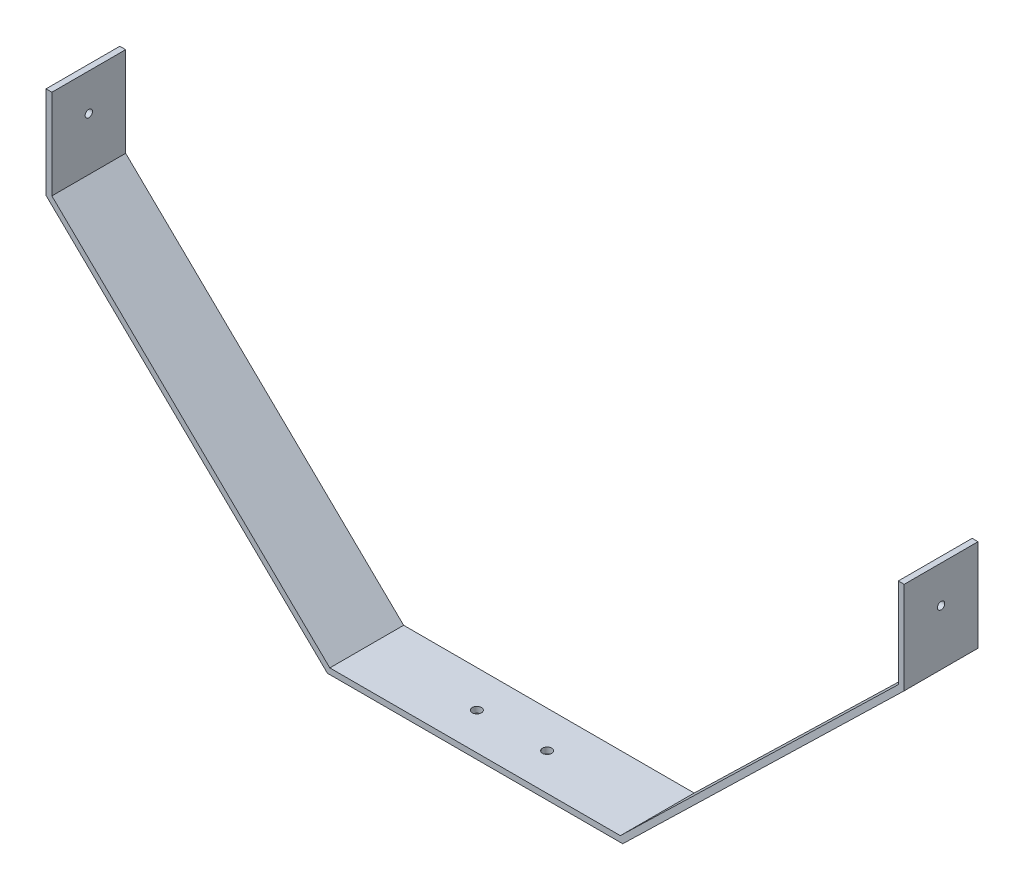
ISO-10303-21;
HEADER;
FILE_DESCRIPTION(('STEP AP214'),'2;1');
FILE_NAME('part.step','',(''),(''),'','','');
FILE_SCHEMA(('AUTOMOTIVE_DESIGN { 1 0 10303 214 1 1 1 1 }'));
ENDSEC;
DATA;
#1=APPLICATION_CONTEXT('core data for automotive mechanical design processes');
#2=APPLICATION_PROTOCOL_DEFINITION('international standard','automotive_design',2000,#1);
#3=PRODUCT_CONTEXT('',#1,'mechanical');
#4=PRODUCT('Part','Part','',(#3));
#5=PRODUCT_RELATED_PRODUCT_CATEGORY('part','',(#4));
#6=PRODUCT_DEFINITION_FORMATION('','',#4);
#7=PRODUCT_DEFINITION_CONTEXT('part definition',#1,'design');
#8=PRODUCT_DEFINITION('design','',#6,#7);
#9=PRODUCT_DEFINITION_SHAPE('','',#8);
#10=(LENGTH_UNIT() NAMED_UNIT(*) SI_UNIT(.MILLI.,.METRE.));
#11=(NAMED_UNIT(*) PLANE_ANGLE_UNIT() SI_UNIT($,.RADIAN.));
#12=(NAMED_UNIT(*) SI_UNIT($,.STERADIAN.) SOLID_ANGLE_UNIT());
#13=UNCERTAINTY_MEASURE_WITH_UNIT(LENGTH_MEASURE(1.E-05),#10,'distance_accuracy_value','');
#14=(GEOMETRIC_REPRESENTATION_CONTEXT(3) GLOBAL_UNCERTAINTY_ASSIGNED_CONTEXT((#13)) GLOBAL_UNIT_ASSIGNED_CONTEXT((#10,
#11,#12)) REPRESENTATION_CONTEXT('',''));
#15=CARTESIAN_POINT('',(0.,0.,0.));
#16=DIRECTION('',(0.,0.,1.));
#17=DIRECTION('',(1.,0.,0.));
#18=AXIS2_PLACEMENT_3D('',#15,#16,#17);
#19=CARTESIAN_POINT('',(-80.,0.,40.));
#20=DIRECTION('',(0.696439743144263,0.717615275875001,0.));
#21=DIRECTION('',(-0.717615275875001,0.696439743144263,0.));
#22=AXIS2_PLACEMENT_3D('',#19,#20,#21);
#23=PLANE('',#22);
#24=DIRECTION('',(0.717615275875001,-0.696439743144263,0.));
#25=VECTOR('',#24,1.);
#26=CARTESIAN_POINT('',(-80.,0.,0.));
#27=LINE('',#26,#25);
#28=CARTESIAN_POINT('',(-232.5,148.,0.));
#29=VERTEX_POINT('',#28);
#30=CARTESIAN_POINT('',(-80.,0.,0.));
#31=VERTEX_POINT('',#30);
#32=EDGE_CURVE('E155',#29,#31,#27,.T.);
#33=ORIENTED_EDGE('',*,*,#32,.T.);
#34=DIRECTION('',(0.,0.,-1.));
#35=VECTOR('',#34,1.);
#36=CARTESIAN_POINT('',(-80.,0.,40.));
#37=LINE('',#36,#35);
#38=CARTESIAN_POINT('',(-80.,0.,40.));
#39=VERTEX_POINT('',#38);
#40=EDGE_CURVE('E11',#39,#31,#37,.T.);
#41=ORIENTED_EDGE('',*,*,#40,.F.);
#42=DIRECTION('',(0.717615275875001,-0.696439743144263,0.));
#43=VECTOR('',#42,1.);
#44=CARTESIAN_POINT('',(-80.,0.,40.));
#45=LINE('',#44,#43);
#46=CARTESIAN_POINT('',(-232.5,148.,40.));
#47=VERTEX_POINT('',#46);
#48=EDGE_CURVE('E177',#47,#39,#45,.T.);
#49=ORIENTED_EDGE('',*,*,#48,.F.);
#50=DIRECTION('',(0.,0.,-1.));
#51=VECTOR('',#50,1.);
#52=CARTESIAN_POINT('',(-232.5,148.,40.));
#53=LINE('',#52,#51);
#54=EDGE_CURVE('E151',#47,#29,#53,.T.);
#55=ORIENTED_EDGE('',*,*,#54,.T.);
#56=EDGE_LOOP('',(#33,#41,#49,#55));
#57=FACE_BOUND('',#56,.T.);
#58=ADVANCED_FACE('F33',(#57),#23,.F.);
#59=CARTESIAN_POINT('',(-80.,0.,40.));
#60=DIRECTION('',(0.,1.,0.));
#61=DIRECTION('',(0.,0.,1.));
#62=AXIS2_PLACEMENT_3D('',#59,#60,#61);
#63=PLANE('',#62);
#64=CARTESIAN_POINT('',(-19.05,0.,20.));
#65=DIRECTION('',(0.,1.,0.));
#66=DIRECTION('',(0.,0.,1.));
#67=AXIS2_PLACEMENT_3D('',#64,#65,#66);
#68=CIRCLE('',#67,2.5);
#69=CARTESIAN_POINT('',(-19.05,0.,22.5));
#70=VERTEX_POINT('',#69);
#71=EDGE_CURVE('E202',#70,#70,#68,.T.);
#72=ORIENTED_EDGE('',*,*,#71,.T.);
#73=EDGE_LOOP('',(#72));
#74=FACE_BOUND('',#73,.T.);
#75=CARTESIAN_POINT('',(19.05,0.,20.));
#76=DIRECTION('',(0.,1.,0.));
#77=DIRECTION('',(0.,0.,1.));
#78=AXIS2_PLACEMENT_3D('',#75,#76,#77);
#79=CIRCLE('',#78,2.5);
#80=CARTESIAN_POINT('',(19.05,0.,22.5));
#81=VERTEX_POINT('',#80);
#82=EDGE_CURVE('E207',#81,#81,#79,.T.);
#83=ORIENTED_EDGE('',*,*,#82,.T.);
#84=EDGE_LOOP('',(#83));
#85=FACE_BOUND('',#84,.T.);
#86=DIRECTION('',(1.,0.,0.));
#87=VECTOR('',#86,1.);
#88=CARTESIAN_POINT('',(-80.,0.,0.));
#89=LINE('',#88,#87);
#90=CARTESIAN_POINT('',(80.,0.,0.));
#91=VERTEX_POINT('',#90);
#92=EDGE_CURVE('E158',#31,#91,#89,.T.);
#93=ORIENTED_EDGE('',*,*,#92,.T.);
#94=DIRECTION('',(0.,0.,-1.));
#95=VECTOR('',#94,1.);
#96=CARTESIAN_POINT('',(80.,0.,40.));
#97=LINE('',#96,#95);
#98=CARTESIAN_POINT('',(80.,0.,40.));
#99=VERTEX_POINT('',#98);
#100=EDGE_CURVE('E42',#99,#91,#97,.T.);
#101=ORIENTED_EDGE('',*,*,#100,.F.);
#102=DIRECTION('',(1.,0.,0.));
#103=VECTOR('',#102,1.);
#104=CARTESIAN_POINT('',(-80.,0.,40.));
#105=LINE('',#104,#103);
#106=EDGE_CURVE('E106',#39,#99,#105,.T.);
#107=ORIENTED_EDGE('',*,*,#106,.F.);
#108=ORIENTED_EDGE('',*,*,#40,.T.);
#109=EDGE_LOOP('',(#93,#101,#107,#108));
#110=FACE_BOUND('',#109,.T.);
#111=ADVANCED_FACE('F260',(#74,#85,#110),#63,.F.);
#112=CARTESIAN_POINT('',(80.,0.,40.));
#113=DIRECTION('',(-0.696439743144263,0.717615275875001,0.));
#114=DIRECTION('',(-0.717615275875001,-0.696439743144263,0.));
#115=AXIS2_PLACEMENT_3D('',#112,#113,#114);
#116=PLANE('',#115);
#117=DIRECTION('',(0.717615275875001,0.696439743144263,0.));
#118=VECTOR('',#117,1.);
#119=CARTESIAN_POINT('',(80.,0.,0.));
#120=LINE('',#119,#118);
#121=CARTESIAN_POINT('',(232.5,148.,0.));
#122=VERTEX_POINT('',#121);
#123=EDGE_CURVE('E160',#91,#122,#120,.T.);
#124=ORIENTED_EDGE('',*,*,#123,.T.);
#125=DIRECTION('',(0.,0.,-1.));
#126=VECTOR('',#125,1.);
#127=CARTESIAN_POINT('',(232.5,148.,40.));
#128=LINE('',#127,#126);
#129=CARTESIAN_POINT('',(232.5,148.,40.));
#130=VERTEX_POINT('',#129);
#131=EDGE_CURVE('E196',#130,#122,#128,.T.);
#132=ORIENTED_EDGE('',*,*,#131,.F.);
#133=DIRECTION('',(0.717615275875001,0.696439743144263,0.));
#134=VECTOR('',#133,1.);
#135=CARTESIAN_POINT('',(80.,0.,40.));
#136=LINE('',#135,#134);
#137=EDGE_CURVE('E219',#99,#130,#136,.T.);
#138=ORIENTED_EDGE('',*,*,#137,.F.);
#139=ORIENTED_EDGE('',*,*,#100,.T.);
#140=EDGE_LOOP('',(#124,#132,#138,#139));
#141=FACE_BOUND('',#140,.T.);
#142=ADVANCED_FACE('F264',(#141),#116,.F.);
#143=CARTESIAN_POINT('',(232.5,148.,40.));
#144=DIRECTION('',(-1.,0.,0.));
#145=DIRECTION('',(0.,0.,1.));
#146=AXIS2_PLACEMENT_3D('',#143,#144,#145);
#147=PLANE('',#146);
#148=CARTESIAN_POINT('',(232.5,178.,20.));
#149=DIRECTION('',(-1.,0.,0.));
#150=DIRECTION('',(0.,0.,1.));
#151=AXIS2_PLACEMENT_3D('',#148,#149,#150);
#152=CIRCLE('',#151,1.98437500000001);
#153=CARTESIAN_POINT('',(232.5,178.,21.984375));
#154=VERTEX_POINT('',#153);
#155=EDGE_CURVE('E301',#154,#154,#152,.T.);
#156=ORIENTED_EDGE('',*,*,#155,.T.);
#157=EDGE_LOOP('',(#156));
#158=FACE_BOUND('',#157,.T.);
#159=DIRECTION('',(0.,1.,0.));
#160=VECTOR('',#159,1.);
#161=CARTESIAN_POINT('',(232.5,148.,0.));
#162=LINE('',#161,#160);
#163=CARTESIAN_POINT('',(232.5,198.,0.));
#164=VERTEX_POINT('',#163);
#165=EDGE_CURVE('E162',#122,#164,#162,.T.);
#166=ORIENTED_EDGE('',*,*,#165,.T.);
#167=DIRECTION('',(0.,0.,-1.));
#168=VECTOR('',#167,1.);
#169=CARTESIAN_POINT('',(232.5,198.,40.));
#170=LINE('',#169,#168);
#171=CARTESIAN_POINT('',(232.5,198.,40.));
#172=VERTEX_POINT('',#171);
#173=EDGE_CURVE('E193',#172,#164,#170,.T.);
#174=ORIENTED_EDGE('',*,*,#173,.F.);
#175=DIRECTION('',(0.,1.,0.));
#176=VECTOR('',#175,1.);
#177=CARTESIAN_POINT('',(232.5,148.,40.));
#178=LINE('',#177,#176);
#179=EDGE_CURVE('E221',#130,#172,#178,.T.);
#180=ORIENTED_EDGE('',*,*,#179,.F.);
#181=ORIENTED_EDGE('',*,*,#131,.T.);
#182=EDGE_LOOP('',(#166,#174,#180,#181));
#183=FACE_BOUND('',#182,.T.);
#184=ADVANCED_FACE('F268',(#158,#183),#147,.F.);
#185=CARTESIAN_POINT('',(229.325,198.,40.));
#186=DIRECTION('',(0.,-1.,0.));
#187=DIRECTION('',(0.,0.,-1.));
#188=AXIS2_PLACEMENT_3D('',#185,#186,#187);
#189=PLANE('',#188);
#190=DIRECTION('',(-1.,0.,0.));
#191=VECTOR('',#190,1.);
#192=CARTESIAN_POINT('',(229.325,198.,0.));
#193=LINE('',#192,#191);
#194=CARTESIAN_POINT('',(229.325,198.,0.));
#195=VERTEX_POINT('',#194);
#196=EDGE_CURVE('E164',#164,#195,#193,.T.);
#197=ORIENTED_EDGE('',*,*,#196,.T.);
#198=DIRECTION('',(0.,0.,-1.));
#199=VECTOR('',#198,1.);
#200=CARTESIAN_POINT('',(229.325,198.,40.));
#201=LINE('',#200,#199);
#202=CARTESIAN_POINT('',(229.325,198.,40.));
#203=VERTEX_POINT('',#202);
#204=EDGE_CURVE('E190',#203,#195,#201,.T.);
#205=ORIENTED_EDGE('',*,*,#204,.F.);
#206=DIRECTION('',(-1.,0.,0.));
#207=VECTOR('',#206,1.);
#208=CARTESIAN_POINT('',(229.325,198.,40.));
#209=LINE('',#208,#207);
#210=EDGE_CURVE('E223',#172,#203,#209,.T.);
#211=ORIENTED_EDGE('',*,*,#210,.F.);
#212=ORIENTED_EDGE('',*,*,#173,.T.);
#213=EDGE_LOOP('',(#197,#205,#211,#212));
#214=FACE_BOUND('',#213,.T.);
#215=ADVANCED_FACE('F275',(#214),#189,.F.);
#216=CARTESIAN_POINT('',(229.325,149.343064797975,40.));
#217=DIRECTION('',(1.,0.,0.));
#218=DIRECTION('',(0.,1.,0.));
#219=AXIS2_PLACEMENT_3D('',#216,#217,#218);
#220=PLANE('',#219);
#221=CARTESIAN_POINT('',(229.325,178.,20.));
#222=DIRECTION('',(1.,0.,0.));
#223=DIRECTION('',(0.,1.,0.));
#224=AXIS2_PLACEMENT_3D('',#221,#222,#223);
#225=CIRCLE('',#224,1.98437500000001);
#226=CARTESIAN_POINT('',(229.325,179.984375,20.));
#227=VERTEX_POINT('',#226);
#228=EDGE_CURVE('E212',#227,#227,#225,.T.);
#229=ORIENTED_EDGE('',*,*,#228,.T.);
#230=EDGE_LOOP('',(#229));
#231=FACE_BOUND('',#230,.T.);
#232=DIRECTION('',(0.,-1.,0.));
#233=VECTOR('',#232,1.);
#234=CARTESIAN_POINT('',(229.325,149.343064797975,0.));
#235=LINE('',#234,#233);
#236=CARTESIAN_POINT('',(229.325,149.343064797975,0.));
#237=VERTEX_POINT('',#236);
#238=EDGE_CURVE('E166',#195,#237,#235,.T.);
#239=ORIENTED_EDGE('',*,*,#238,.T.);
#240=DIRECTION('',(0.,0.,-1.));
#241=VECTOR('',#240,1.);
#242=CARTESIAN_POINT('',(229.325,149.343064797975,40.));
#243=LINE('',#242,#241);
#244=CARTESIAN_POINT('',(229.325,149.343064797975,40.));
#245=VERTEX_POINT('',#244);
#246=EDGE_CURVE('E187',#245,#237,#243,.T.);
#247=ORIENTED_EDGE('',*,*,#246,.F.);
#248=DIRECTION('',(0.,-1.,0.));
#249=VECTOR('',#248,1.);
#250=CARTESIAN_POINT('',(229.325,149.343064797975,40.));
#251=LINE('',#250,#249);
#252=EDGE_CURVE('E225',#203,#245,#251,.T.);
#253=ORIENTED_EDGE('',*,*,#252,.F.);
#254=ORIENTED_EDGE('',*,*,#204,.T.);
#255=EDGE_LOOP('',(#239,#247,#253,#254));
#256=FACE_BOUND('',#255,.T.);
#257=ADVANCED_FACE('F279',(#231,#256),#220,.F.);
#258=CARTESIAN_POINT('',(78.7126359345188,3.175,40.));
#259=DIRECTION('',(0.696439743144263,-0.717615275875001,0.));
#260=DIRECTION('',(0.717615275875001,0.696439743144263,0.));
#261=AXIS2_PLACEMENT_3D('',#258,#259,#260);
#262=PLANE('',#261);
#263=DIRECTION('',(-0.717615275875001,-0.696439743144263,0.));
#264=VECTOR('',#263,1.);
#265=CARTESIAN_POINT('',(78.7126359345188,3.175,0.));
#266=LINE('',#265,#264);
#267=CARTESIAN_POINT('',(78.7126359345188,3.175,0.));
#268=VERTEX_POINT('',#267);
#269=EDGE_CURVE('E168',#237,#268,#266,.T.);
#270=ORIENTED_EDGE('',*,*,#269,.T.);
#271=DIRECTION('',(0.,0.,-1.));
#272=VECTOR('',#271,1.);
#273=CARTESIAN_POINT('',(78.7126359345188,3.175,40.));
#274=LINE('',#273,#272);
#275=CARTESIAN_POINT('',(78.7126359345188,3.175,40.));
#276=VERTEX_POINT('',#275);
#277=EDGE_CURVE('E184',#276,#268,#274,.T.);
#278=ORIENTED_EDGE('',*,*,#277,.F.);
#279=DIRECTION('',(-0.717615275875001,-0.696439743144263,0.));
#280=VECTOR('',#279,1.);
#281=CARTESIAN_POINT('',(78.7126359345188,3.175,40.));
#282=LINE('',#281,#280);
#283=EDGE_CURVE('E227',#245,#276,#282,.T.);
#284=ORIENTED_EDGE('',*,*,#283,.F.);
#285=ORIENTED_EDGE('',*,*,#246,.T.);
#286=EDGE_LOOP('',(#270,#278,#284,#285));
#287=FACE_BOUND('',#286,.T.);
#288=ADVANCED_FACE('F283',(#287),#262,.F.);
#289=CARTESIAN_POINT('',(-78.7126359345188,3.175,40.));
#290=DIRECTION('',(0.,-1.,0.));
#291=DIRECTION('',(1.,0.,0.));
#292=AXIS2_PLACEMENT_3D('',#289,#290,#291);
#293=PLANE('',#292);
#294=CARTESIAN_POINT('',(-19.05,3.175,20.));
#295=DIRECTION('',(0.,-1.,0.));
#296=DIRECTION('',(1.,0.,0.));
#297=AXIS2_PLACEMENT_3D('',#294,#295,#296);
#298=CIRCLE('',#297,2.5);
#299=CARTESIAN_POINT('',(-19.05,3.175,22.5));
#300=VERTEX_POINT('',#299);
#301=EDGE_CURVE('E36',#300,#300,#298,.T.);
#302=ORIENTED_EDGE('',*,*,#301,.T.);
#303=EDGE_LOOP('',(#302));
#304=FACE_BOUND('',#303,.T.);
#305=CARTESIAN_POINT('',(19.05,3.175,20.));
#306=DIRECTION('',(0.,-1.,0.));
#307=DIRECTION('',(1.,0.,0.));
#308=AXIS2_PLACEMENT_3D('',#305,#306,#307);
#309=CIRCLE('',#308,2.5);
#310=CARTESIAN_POINT('',(19.05,3.175,22.5));
#311=VERTEX_POINT('',#310);
#312=EDGE_CURVE('E200',#311,#311,#309,.T.);
#313=ORIENTED_EDGE('',*,*,#312,.T.);
#314=EDGE_LOOP('',(#313));
#315=FACE_BOUND('',#314,.T.);
#316=DIRECTION('',(-1.,0.,0.));
#317=VECTOR('',#316,1.);
#318=CARTESIAN_POINT('',(-78.7126359345188,3.175,0.));
#319=LINE('',#318,#317);
#320=CARTESIAN_POINT('',(-78.7126359345188,3.175,0.));
#321=VERTEX_POINT('',#320);
#322=EDGE_CURVE('E170',#268,#321,#319,.T.);
#323=ORIENTED_EDGE('',*,*,#322,.T.);
#324=DIRECTION('',(0.,0.,-1.));
#325=VECTOR('',#324,1.);
#326=CARTESIAN_POINT('',(-78.7126359345188,3.175,40.));
#327=LINE('',#326,#325);
#328=CARTESIAN_POINT('',(-78.7126359345188,3.175,40.));
#329=VERTEX_POINT('',#328);
#330=EDGE_CURVE('E181',#329,#321,#327,.T.);
#331=ORIENTED_EDGE('',*,*,#330,.F.);
#332=DIRECTION('',(-1.,0.,0.));
#333=VECTOR('',#332,1.);
#334=CARTESIAN_POINT('',(-78.7126359345188,3.175,40.));
#335=LINE('',#334,#333);
#336=EDGE_CURVE('E229',#276,#329,#335,.T.);
#337=ORIENTED_EDGE('',*,*,#336,.F.);
#338=ORIENTED_EDGE('',*,*,#277,.T.);
#339=EDGE_LOOP('',(#323,#331,#337,#338));
#340=FACE_BOUND('',#339,.T.);
#341=ADVANCED_FACE('F235',(#304,#315,#340),#293,.F.);
#342=CARTESIAN_POINT('',(-78.7126359345188,3.175,40.));
#343=DIRECTION('',(-0.696439743144263,-0.717615275875001,0.));
#344=DIRECTION('',(0.717615275875001,-0.696439743144263,0.));
#345=AXIS2_PLACEMENT_3D('',#342,#343,#344);
#346=PLANE('',#345);
#347=DIRECTION('',(-0.717615275875001,0.696439743144263,0.));
#348=VECTOR('',#347,1.);
#349=CARTESIAN_POINT('',(-78.7126359345188,3.175,0.));
#350=LINE('',#349,#348);
#351=CARTESIAN_POINT('',(-229.325,149.343064797975,0.));
#352=VERTEX_POINT('',#351);
#353=EDGE_CURVE('E172',#321,#352,#350,.T.);
#354=ORIENTED_EDGE('',*,*,#353,.T.);
#355=DIRECTION('',(0.,0.,-1.));
#356=VECTOR('',#355,1.);
#357=CARTESIAN_POINT('',(-229.325,149.343064797975,40.));
#358=LINE('',#357,#356);
#359=CARTESIAN_POINT('',(-229.325,149.343064797975,40.));
#360=VERTEX_POINT('',#359);
#361=EDGE_CURVE('E146',#360,#352,#358,.T.);
#362=ORIENTED_EDGE('',*,*,#361,.F.);
#363=DIRECTION('',(-0.717615275875001,0.696439743144263,0.));
#364=VECTOR('',#363,1.);
#365=CARTESIAN_POINT('',(-78.7126359345188,3.175,40.));
#366=LINE('',#365,#364);
#367=EDGE_CURVE('E137',#329,#360,#366,.T.);
#368=ORIENTED_EDGE('',*,*,#367,.F.);
#369=ORIENTED_EDGE('',*,*,#330,.T.);
#370=EDGE_LOOP('',(#354,#362,#368,#369));
#371=FACE_BOUND('',#370,.T.);
#372=ADVANCED_FACE('F239',(#371),#346,.F.);
#373=CARTESIAN_POINT('',(-229.325,149.343064797975,40.));
#374=DIRECTION('',(-1.,0.,0.));
#375=DIRECTION('',(0.,-1.,0.));
#376=AXIS2_PLACEMENT_3D('',#373,#374,#375);
#377=PLANE('',#376);
#378=CARTESIAN_POINT('',(-229.325,178.,20.));
#379=DIRECTION('',(-1.,0.,0.));
#380=DIRECTION('',(0.,-1.,0.));
#381=AXIS2_PLACEMENT_3D('',#378,#379,#380);
#382=CIRCLE('',#381,1.98437500000001);
#383=CARTESIAN_POINT('',(-229.325,176.015625,20.));
#384=VERTEX_POINT('',#383);
#385=EDGE_CURVE('E299',#384,#384,#382,.T.);
#386=ORIENTED_EDGE('',*,*,#385,.T.);
#387=EDGE_LOOP('',(#386));
#388=FACE_BOUND('',#387,.T.);
#389=DIRECTION('',(0.,1.,0.));
#390=VECTOR('',#389,1.);
#391=CARTESIAN_POINT('',(-229.325,149.343064797975,0.));
#392=LINE('',#391,#390);
#393=CARTESIAN_POINT('',(-229.325,198.,0.));
#394=VERTEX_POINT('',#393);
#395=EDGE_CURVE('E145',#352,#394,#392,.T.);
#396=ORIENTED_EDGE('',*,*,#395,.T.);
#397=DIRECTION('',(0.,0.,-1.));
#398=VECTOR('',#397,1.);
#399=CARTESIAN_POINT('',(-229.325,198.,40.));
#400=LINE('',#399,#398);
#401=CARTESIAN_POINT('',(-229.325,198.,40.));
#402=VERTEX_POINT('',#401);
#403=EDGE_CURVE('E142',#402,#394,#400,.T.);
#404=ORIENTED_EDGE('',*,*,#403,.F.);
#405=DIRECTION('',(0.,1.,0.));
#406=VECTOR('',#405,1.);
#407=CARTESIAN_POINT('',(-229.325,149.343064797975,40.));
#408=LINE('',#407,#406);
#409=EDGE_CURVE('E131',#360,#402,#408,.T.);
#410=ORIENTED_EDGE('',*,*,#409,.F.);
#411=ORIENTED_EDGE('',*,*,#361,.T.);
#412=EDGE_LOOP('',(#396,#404,#410,#411));
#413=FACE_BOUND('',#412,.T.);
#414=ADVANCED_FACE('F143',(#388,#413),#377,.F.);
#415=CARTESIAN_POINT('',(-232.5,198.,40.));
#416=DIRECTION('',(0.,-1.,0.));
#417=DIRECTION('',(0.,0.,-1.));
#418=AXIS2_PLACEMENT_3D('',#415,#416,#417);
#419=PLANE('',#418);
#420=DIRECTION('',(-1.,0.,0.));
#421=VECTOR('',#420,1.);
#422=CARTESIAN_POINT('',(-232.5,198.,0.));
#423=LINE('',#422,#421);
#424=CARTESIAN_POINT('',(-232.5,198.,0.));
#425=VERTEX_POINT('',#424);
#426=EDGE_CURVE('E92',#394,#425,#423,.T.);
#427=ORIENTED_EDGE('',*,*,#426,.T.);
#428=DIRECTION('',(0.,0.,-1.));
#429=VECTOR('',#428,1.);
#430=CARTESIAN_POINT('',(-232.5,198.,40.));
#431=LINE('',#430,#429);
#432=CARTESIAN_POINT('',(-232.5,198.,40.));
#433=VERTEX_POINT('',#432);
#434=EDGE_CURVE('E147',#433,#425,#431,.T.);
#435=ORIENTED_EDGE('',*,*,#434,.F.);
#436=DIRECTION('',(-1.,0.,0.));
#437=VECTOR('',#436,1.);
#438=CARTESIAN_POINT('',(-232.5,198.,40.));
#439=LINE('',#438,#437);
#440=EDGE_CURVE('E135',#402,#433,#439,.T.);
#441=ORIENTED_EDGE('',*,*,#440,.F.);
#442=ORIENTED_EDGE('',*,*,#403,.T.);
#443=EDGE_LOOP('',(#427,#435,#441,#442));
#444=FACE_BOUND('',#443,.T.);
#445=ADVANCED_FACE('F149',(#444),#419,.F.);
#446=CARTESIAN_POINT('',(-232.5,148.,40.));
#447=DIRECTION('',(1.,0.,0.));
#448=DIRECTION('',(0.,0.,-1.));
#449=AXIS2_PLACEMENT_3D('',#446,#447,#448);
#450=PLANE('',#449);
#451=CARTESIAN_POINT('',(-232.5,178.,20.));
#452=DIRECTION('',(-1.,0.,0.));
#453=DIRECTION('',(0.,0.,1.));
#454=AXIS2_PLACEMENT_3D('',#451,#452,#453);
#455=CIRCLE('',#454,1.98437500000001);
#456=CARTESIAN_POINT('',(-232.5,178.,21.984375));
#457=VERTEX_POINT('',#456);
#458=EDGE_CURVE('E304',#457,#457,#455,.T.);
#459=ORIENTED_EDGE('',*,*,#458,.F.);
#460=EDGE_LOOP('',(#459));
#461=FACE_BOUND('',#460,.T.);
#462=DIRECTION('',(0.,-1.,0.));
#463=VECTOR('',#462,1.);
#464=CARTESIAN_POINT('',(-232.5,148.,0.));
#465=LINE('',#464,#463);
#466=EDGE_CURVE('E98',#425,#29,#465,.T.);
#467=ORIENTED_EDGE('',*,*,#466,.T.);
#468=ORIENTED_EDGE('',*,*,#54,.F.);
#469=DIRECTION('',(0.,-1.,0.));
#470=VECTOR('',#469,1.);
#471=CARTESIAN_POINT('',(-232.5,148.,40.));
#472=LINE('',#471,#470);
#473=EDGE_CURVE('E51',#433,#47,#472,.T.);
#474=ORIENTED_EDGE('',*,*,#473,.F.);
#475=ORIENTED_EDGE('',*,*,#434,.T.);
#476=EDGE_LOOP('',(#467,#468,#474,#475));
#477=FACE_BOUND('',#476,.T.);
#478=ADVANCED_FACE('F247',(#461,#477),#450,.F.);
#479=CARTESIAN_POINT('',(0.,0.,40.));
#480=DIRECTION('',(0.,0.,-1.));
#481=DIRECTION('',(-1.,0.,0.));
#482=AXIS2_PLACEMENT_3D('',#479,#480,#481);
#483=PLANE('',#482);
#484=ORIENTED_EDGE('',*,*,#48,.T.);
#485=ORIENTED_EDGE('',*,*,#106,.T.);
#486=ORIENTED_EDGE('',*,*,#137,.T.);
#487=ORIENTED_EDGE('',*,*,#179,.T.);
#488=ORIENTED_EDGE('',*,*,#210,.T.);
#489=ORIENTED_EDGE('',*,*,#252,.T.);
#490=ORIENTED_EDGE('',*,*,#283,.T.);
#491=ORIENTED_EDGE('',*,*,#336,.T.);
#492=ORIENTED_EDGE('',*,*,#367,.T.);
#493=ORIENTED_EDGE('',*,*,#409,.T.);
#494=ORIENTED_EDGE('',*,*,#440,.T.);
#495=ORIENTED_EDGE('',*,*,#473,.T.);
#496=EDGE_LOOP('',(#484,#485,#486,#487,#488,#489,#490,#491,#492,#493,#494,#495));
#497=FACE_BOUND('',#496,.T.);
#498=ADVANCED_FACE('F133',(#497),#483,.F.);
#499=CARTESIAN_POINT('',(0.,0.,0.));
#500=DIRECTION('',(0.,0.,-1.));
#501=DIRECTION('',(-1.,0.,0.));
#502=AXIS2_PLACEMENT_3D('',#499,#500,#501);
#503=PLANE('',#502);
#504=ORIENTED_EDGE('',*,*,#32,.F.);
#505=ORIENTED_EDGE('',*,*,#466,.F.);
#506=ORIENTED_EDGE('',*,*,#426,.F.);
#507=ORIENTED_EDGE('',*,*,#395,.F.);
#508=ORIENTED_EDGE('',*,*,#353,.F.);
#509=ORIENTED_EDGE('',*,*,#322,.F.);
#510=ORIENTED_EDGE('',*,*,#269,.F.);
#511=ORIENTED_EDGE('',*,*,#238,.F.);
#512=ORIENTED_EDGE('',*,*,#196,.F.);
#513=ORIENTED_EDGE('',*,*,#165,.F.);
#514=ORIENTED_EDGE('',*,*,#123,.F.);
#515=ORIENTED_EDGE('',*,*,#92,.F.);
#516=EDGE_LOOP('',(#504,#505,#506,#507,#508,#509,#510,#511,#512,#513,#514,#515));
#517=FACE_BOUND('',#516,.T.);
#518=ADVANCED_FACE('F242',(#517),#503,.T.);
#519=CARTESIAN_POINT('',(19.05,0.,20.));
#520=DIRECTION('',(0.,1.,0.));
#521=DIRECTION('',(0.,0.,1.));
#522=AXIS2_PLACEMENT_3D('',#519,#520,#521);
#523=CYLINDRICAL_SURFACE('',#522,2.5);
#524=CARTESIAN_POINT('',(19.05,0.,22.5));
#525=CARTESIAN_POINT('',(19.05,0.0330729166666667,22.5));
#526=CARTESIAN_POINT('',(19.05,0.0661458333333333,22.5));
#527=CARTESIAN_POINT('',(19.05,0.132291666666667,22.5));
#528=CARTESIAN_POINT('',(19.05,0.165364583333333,22.5));
#529=CARTESIAN_POINT('',(19.05,0.231510416666667,22.5));
#530=CARTESIAN_POINT('',(19.05,0.264583333333333,22.5));
#531=CARTESIAN_POINT('',(19.05,0.330729166666667,22.5));
#532=CARTESIAN_POINT('',(19.05,0.363802083333333,22.5));
#533=CARTESIAN_POINT('',(19.05,0.429947916666667,22.5));
#534=CARTESIAN_POINT('',(19.05,0.463020833333333,22.5));
#535=CARTESIAN_POINT('',(19.05,0.529166666666667,22.5));
#536=CARTESIAN_POINT('',(19.05,0.562239583333333,22.5));
#537=CARTESIAN_POINT('',(19.05,0.628385416666667,22.5));
#538=CARTESIAN_POINT('',(19.05,0.661458333333333,22.5));
#539=CARTESIAN_POINT('',(19.05,0.727604166666667,22.5));
#540=CARTESIAN_POINT('',(19.05,0.760677083333333,22.5));
#541=CARTESIAN_POINT('',(19.05,0.826822916666667,22.5));
#542=CARTESIAN_POINT('',(19.05,0.859895833333333,22.5));
#543=CARTESIAN_POINT('',(19.05,0.926041666666667,22.5));
#544=CARTESIAN_POINT('',(19.05,0.959114583333333,22.5));
#545=CARTESIAN_POINT('',(19.05,1.02526041666667,22.5));
#546=CARTESIAN_POINT('',(19.05,1.05833333333333,22.5));
#547=CARTESIAN_POINT('',(19.05,1.12447916666667,22.5));
#548=CARTESIAN_POINT('',(19.05,1.15755208333333,22.5));
#549=CARTESIAN_POINT('',(19.05,1.22369791666667,22.5));
#550=CARTESIAN_POINT('',(19.05,1.25677083333333,22.5));
#551=CARTESIAN_POINT('',(19.05,1.32291666666667,22.5));
#552=CARTESIAN_POINT('',(19.05,1.35598958333333,22.5));
#553=CARTESIAN_POINT('',(19.05,1.42213541666667,22.5));
#554=CARTESIAN_POINT('',(19.05,1.45520833333333,22.5));
#555=CARTESIAN_POINT('',(19.05,1.52135416666667,22.5));
#556=CARTESIAN_POINT('',(19.05,1.55442708333333,22.5));
#557=CARTESIAN_POINT('',(19.05,1.62057291666667,22.5));
#558=CARTESIAN_POINT('',(19.05,1.65364583333333,22.5));
#559=CARTESIAN_POINT('',(19.05,1.71979166666667,22.5));
#560=CARTESIAN_POINT('',(19.05,1.75286458333333,22.5));
#561=CARTESIAN_POINT('',(19.05,1.81901041666667,22.5));
#562=CARTESIAN_POINT('',(19.05,1.85208333333333,22.5));
#563=CARTESIAN_POINT('',(19.05,1.91822916666667,22.5));
#564=CARTESIAN_POINT('',(19.05,1.95130208333333,22.5));
#565=CARTESIAN_POINT('',(19.05,2.01744791666667,22.5));
#566=CARTESIAN_POINT('',(19.05,2.05052083333333,22.5));
#567=CARTESIAN_POINT('',(19.05,2.11666666666667,22.5));
#568=CARTESIAN_POINT('',(19.05,2.14973958333333,22.5));
#569=CARTESIAN_POINT('',(19.05,2.21588541666667,22.5));
#570=CARTESIAN_POINT('',(19.05,2.24895833333333,22.5));
#571=CARTESIAN_POINT('',(19.05,2.31510416666667,22.5));
#572=CARTESIAN_POINT('',(19.05,2.34817708333333,22.5));
#573=CARTESIAN_POINT('',(19.05,2.41432291666667,22.5));
#574=CARTESIAN_POINT('',(19.05,2.44739583333333,22.5));
#575=CARTESIAN_POINT('',(19.05,2.51354166666667,22.5));
#576=CARTESIAN_POINT('',(19.05,2.54661458333333,22.5));
#577=CARTESIAN_POINT('',(19.05,2.61276041666667,22.5));
#578=CARTESIAN_POINT('',(19.05,2.64583333333333,22.5));
#579=CARTESIAN_POINT('',(19.05,2.71197916666667,22.5));
#580=CARTESIAN_POINT('',(19.05,2.74505208333333,22.5));
#581=CARTESIAN_POINT('',(19.05,2.81119791666667,22.5));
#582=CARTESIAN_POINT('',(19.05,2.84427083333333,22.5));
#583=CARTESIAN_POINT('',(19.05,2.91041666666667,22.5));
#584=CARTESIAN_POINT('',(19.05,2.94348958333333,22.5));
#585=CARTESIAN_POINT('',(19.05,3.00963541666667,22.5));
#586=CARTESIAN_POINT('',(19.05,3.04270833333333,22.5));
#587=CARTESIAN_POINT('',(19.05,3.10885416666667,22.5));
#588=CARTESIAN_POINT('',(19.05,3.14192708333333,22.5));
#589=CARTESIAN_POINT('',(19.05,3.175,22.5));
#590=B_SPLINE_CURVE_WITH_KNOTS('',3,(#524,#525,#526,#527,#528,#529,#530,#531,#532,#533,#534,
#535,#536,#537,#538,#539,#540,#541,#542,#543,#544,#545,#546,#547,#548,#549,#550,#551,#552,#553,
#554,#555,#556,#557,#558,#559,#560,#561,#562,#563,#564,#565,#566,#567,#568,#569,#570,#571,#572,
#573,#574,#575,#576,#577,#578,#579,#580,#581,#582,#583,#584,#585,#586,#587,#588,#589),
.UNSPECIFIED.,.F.,.F.,(4,2,2,2,2,2,2,2,2,2,2,2,2,2,2,2,2,2,2,2,2,2,2,2,2,2,2,2,2,2,2,2,4),(0.,
0.09921875,0.1984375,0.29765625,0.396875,0.49609375,0.5953125,0.69453125,0.79375,0.89296875,
0.9921875,1.09140625,1.190625,1.28984375,1.3890625,1.48828125,1.5875,1.68671875,1.7859375,
1.88515625,1.984375,2.08359375,2.1828125,2.28203125,2.38125,2.48046875,2.5796875,2.67890625,
2.778125,2.87734375,2.9765625,3.07578125,3.175),.UNSPECIFIED.);
#591=EDGE_CURVE('BSEAM319',#81,#311,#590,.T.);
#592=ORIENTED_EDGE('',*,*,#82,.F.);
#593=ORIENTED_EDGE('',*,*,#312,.F.);
#594=ORIENTED_EDGE('',*,*,#591,.T.);
#595=ORIENTED_EDGE('',*,*,#591,.F.);
#596=EDGE_LOOP('',(#592,#594,#593,#595));
#597=FACE_BOUND('',#596,.T.);
#598=ADVANCED_FACE('F319',(#597),#523,.F.);
#599=CARTESIAN_POINT('',(-19.05,0.,20.));
#600=DIRECTION('',(0.,1.,0.));
#601=DIRECTION('',(0.,0.,1.));
#602=AXIS2_PLACEMENT_3D('',#599,#600,#601);
#603=CYLINDRICAL_SURFACE('',#602,2.5);
#604=CARTESIAN_POINT('',(-19.05,0.,22.5));
#605=CARTESIAN_POINT('',(-19.05,0.0330729166666667,22.5));
#606=CARTESIAN_POINT('',(-19.05,0.0661458333333333,22.5));
#607=CARTESIAN_POINT('',(-19.05,0.132291666666667,22.5));
#608=CARTESIAN_POINT('',(-19.05,0.165364583333333,22.5));
#609=CARTESIAN_POINT('',(-19.05,0.231510416666667,22.5));
#610=CARTESIAN_POINT('',(-19.05,0.264583333333333,22.5));
#611=CARTESIAN_POINT('',(-19.05,0.330729166666667,22.5));
#612=CARTESIAN_POINT('',(-19.05,0.363802083333333,22.5));
#613=CARTESIAN_POINT('',(-19.05,0.429947916666667,22.5));
#614=CARTESIAN_POINT('',(-19.05,0.463020833333333,22.5));
#615=CARTESIAN_POINT('',(-19.05,0.529166666666667,22.5));
#616=CARTESIAN_POINT('',(-19.05,0.562239583333333,22.5));
#617=CARTESIAN_POINT('',(-19.05,0.628385416666667,22.5));
#618=CARTESIAN_POINT('',(-19.05,0.661458333333333,22.5));
#619=CARTESIAN_POINT('',(-19.05,0.727604166666667,22.5));
#620=CARTESIAN_POINT('',(-19.05,0.760677083333333,22.5));
#621=CARTESIAN_POINT('',(-19.05,0.826822916666667,22.5));
#622=CARTESIAN_POINT('',(-19.05,0.859895833333333,22.5));
#623=CARTESIAN_POINT('',(-19.05,0.926041666666667,22.5));
#624=CARTESIAN_POINT('',(-19.05,0.959114583333333,22.5));
#625=CARTESIAN_POINT('',(-19.05,1.02526041666667,22.5));
#626=CARTESIAN_POINT('',(-19.05,1.05833333333333,22.5));
#627=CARTESIAN_POINT('',(-19.05,1.12447916666667,22.5));
#628=CARTESIAN_POINT('',(-19.05,1.15755208333333,22.5));
#629=CARTESIAN_POINT('',(-19.05,1.22369791666667,22.5));
#630=CARTESIAN_POINT('',(-19.05,1.25677083333333,22.5));
#631=CARTESIAN_POINT('',(-19.05,1.32291666666667,22.5));
#632=CARTESIAN_POINT('',(-19.05,1.35598958333333,22.5));
#633=CARTESIAN_POINT('',(-19.05,1.42213541666667,22.5));
#634=CARTESIAN_POINT('',(-19.05,1.45520833333333,22.5));
#635=CARTESIAN_POINT('',(-19.05,1.52135416666667,22.5));
#636=CARTESIAN_POINT('',(-19.05,1.55442708333333,22.5));
#637=CARTESIAN_POINT('',(-19.05,1.62057291666667,22.5));
#638=CARTESIAN_POINT('',(-19.05,1.65364583333333,22.5));
#639=CARTESIAN_POINT('',(-19.05,1.71979166666667,22.5));
#640=CARTESIAN_POINT('',(-19.05,1.75286458333333,22.5));
#641=CARTESIAN_POINT('',(-19.05,1.81901041666667,22.5));
#642=CARTESIAN_POINT('',(-19.05,1.85208333333333,22.5));
#643=CARTESIAN_POINT('',(-19.05,1.91822916666667,22.5));
#644=CARTESIAN_POINT('',(-19.05,1.95130208333333,22.5));
#645=CARTESIAN_POINT('',(-19.05,2.01744791666667,22.5));
#646=CARTESIAN_POINT('',(-19.05,2.05052083333333,22.5));
#647=CARTESIAN_POINT('',(-19.05,2.11666666666667,22.5));
#648=CARTESIAN_POINT('',(-19.05,2.14973958333333,22.5));
#649=CARTESIAN_POINT('',(-19.05,2.21588541666667,22.5));
#650=CARTESIAN_POINT('',(-19.05,2.24895833333333,22.5));
#651=CARTESIAN_POINT('',(-19.05,2.31510416666667,22.5));
#652=CARTESIAN_POINT('',(-19.05,2.34817708333333,22.5));
#653=CARTESIAN_POINT('',(-19.05,2.41432291666667,22.5));
#654=CARTESIAN_POINT('',(-19.05,2.44739583333333,22.5));
#655=CARTESIAN_POINT('',(-19.05,2.51354166666667,22.5));
#656=CARTESIAN_POINT('',(-19.05,2.54661458333333,22.5));
#657=CARTESIAN_POINT('',(-19.05,2.61276041666667,22.5));
#658=CARTESIAN_POINT('',(-19.05,2.64583333333333,22.5));
#659=CARTESIAN_POINT('',(-19.05,2.71197916666667,22.5));
#660=CARTESIAN_POINT('',(-19.05,2.74505208333333,22.5));
#661=CARTESIAN_POINT('',(-19.05,2.81119791666667,22.5));
#662=CARTESIAN_POINT('',(-19.05,2.84427083333333,22.5));
#663=CARTESIAN_POINT('',(-19.05,2.91041666666667,22.5));
#664=CARTESIAN_POINT('',(-19.05,2.94348958333333,22.5));
#665=CARTESIAN_POINT('',(-19.05,3.00963541666667,22.5));
#666=CARTESIAN_POINT('',(-19.05,3.04270833333333,22.5));
#667=CARTESIAN_POINT('',(-19.05,3.10885416666667,22.5));
#668=CARTESIAN_POINT('',(-19.05,3.14192708333333,22.5));
#669=CARTESIAN_POINT('',(-19.05,3.175,22.5));
#670=B_SPLINE_CURVE_WITH_KNOTS('',3,(#604,#605,#606,#607,#608,#609,#610,#611,#612,#613,#614,
#615,#616,#617,#618,#619,#620,#621,#622,#623,#624,#625,#626,#627,#628,#629,#630,#631,#632,#633,
#634,#635,#636,#637,#638,#639,#640,#641,#642,#643,#644,#645,#646,#647,#648,#649,#650,#651,#652,
#653,#654,#655,#656,#657,#658,#659,#660,#661,#662,#663,#664,#665,#666,#667,#668,#669),
.UNSPECIFIED.,.F.,.F.,(4,2,2,2,2,2,2,2,2,2,2,2,2,2,2,2,2,2,2,2,2,2,2,2,2,2,2,2,2,2,2,2,4),(0.,
0.09921875,0.1984375,0.29765625,0.396875,0.49609375,0.5953125,0.69453125,0.79375,0.89296875,
0.9921875,1.09140625,1.190625,1.28984375,1.3890625,1.48828125,1.5875,1.68671875,1.7859375,
1.88515625,1.984375,2.08359375,2.1828125,2.28203125,2.38125,2.48046875,2.5796875,2.67890625,
2.778125,2.87734375,2.9765625,3.07578125,3.175),.UNSPECIFIED.);
#671=EDGE_CURVE('BSEAM312',#70,#300,#670,.T.);
#672=ORIENTED_EDGE('',*,*,#71,.F.);
#673=ORIENTED_EDGE('',*,*,#301,.F.);
#674=ORIENTED_EDGE('',*,*,#671,.T.);
#675=ORIENTED_EDGE('',*,*,#671,.F.);
#676=EDGE_LOOP('',(#672,#674,#673,#675));
#677=FACE_BOUND('',#676,.T.);
#678=ADVANCED_FACE('F312',(#677),#603,.F.);
#679=CARTESIAN_POINT('',(232.5,178.,20.));
#680=DIRECTION('',(-1.,0.,0.));
#681=DIRECTION('',(0.,0.,1.));
#682=AXIS2_PLACEMENT_3D('',#679,#680,#681);
#683=CYLINDRICAL_SURFACE('',#682,1.98437500000001);
#684=ORIENTED_EDGE('',*,*,#458,.T.);
#685=EDGE_LOOP('',(#684));
#686=FACE_BOUND('',#685,.T.);
#687=ORIENTED_EDGE('',*,*,#385,.F.);
#688=EDGE_LOOP('',(#687));
#689=FACE_BOUND('',#688,.T.);
#690=ADVANCED_FACE('F309',(#686,#689),#683,.F.);
#691=ORIENTED_EDGE('',*,*,#155,.F.);
#692=EDGE_LOOP('',(#691));
#693=FACE_BOUND('',#692,.T.);
#694=ORIENTED_EDGE('',*,*,#228,.F.);
#695=EDGE_LOOP('',(#694));
#696=FACE_BOUND('',#695,.T.);
#697=ADVANCED_FACE('F311',(#693,#696),#683,.F.);
#698=CLOSED_SHELL('',(#58,#111,#142,#184,#215,#257,#288,#341,#372,#414,#445,#478,#498,#518,#598,
#678,#690,#697));
#699=MANIFOLD_SOLID_BREP('B2',#698);
#700=ADVANCED_BREP_SHAPE_REPRESENTATION('',(#18,#699),#14);
#701=SHAPE_DEFINITION_REPRESENTATION(#9,#700);
ENDSEC;
END-ISO-10303-21;
